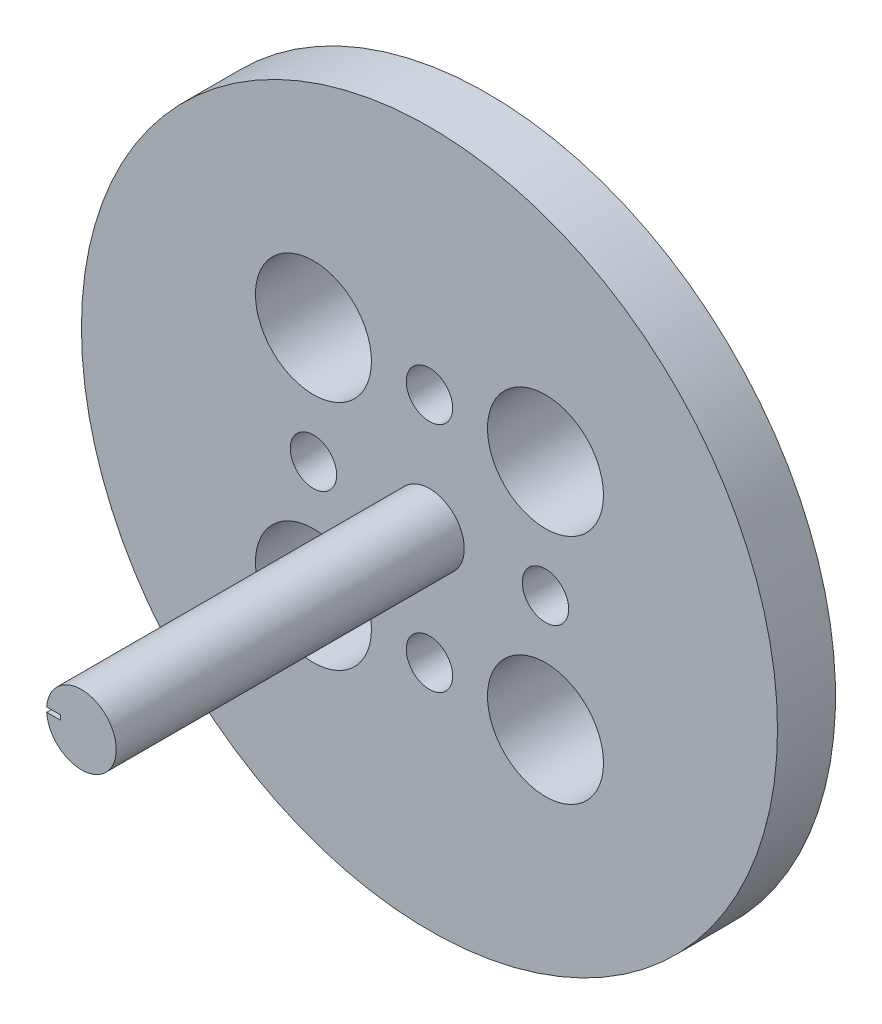
ISO-10303-21;
HEADER;
FILE_DESCRIPTION(('STEP AP214'),'2;1');
FILE_NAME('part.step','',(''),(''),'','','');
FILE_SCHEMA(('AUTOMOTIVE_DESIGN { 1 0 10303 214 1 1 1 1 }'));
ENDSEC;
DATA;
#1=APPLICATION_CONTEXT('core data for automotive mechanical design processes');
#2=APPLICATION_PROTOCOL_DEFINITION('international standard','automotive_design',2000,#1);
#3=PRODUCT_CONTEXT('',#1,'mechanical');
#4=PRODUCT('Part','Part','',(#3));
#5=PRODUCT_RELATED_PRODUCT_CATEGORY('part','',(#4));
#6=PRODUCT_DEFINITION_FORMATION('','',#4);
#7=PRODUCT_DEFINITION_CONTEXT('part definition',#1,'design');
#8=PRODUCT_DEFINITION('design','',#6,#7);
#9=PRODUCT_DEFINITION_SHAPE('','',#8);
#10=(LENGTH_UNIT() NAMED_UNIT(*) SI_UNIT(.MILLI.,.METRE.));
#11=(NAMED_UNIT(*) PLANE_ANGLE_UNIT() SI_UNIT($,.RADIAN.));
#12=(NAMED_UNIT(*) SI_UNIT($,.STERADIAN.) SOLID_ANGLE_UNIT());
#13=UNCERTAINTY_MEASURE_WITH_UNIT(LENGTH_MEASURE(1.E-05),#10,'distance_accuracy_value','');
#14=(GEOMETRIC_REPRESENTATION_CONTEXT(3) GLOBAL_UNCERTAINTY_ASSIGNED_CONTEXT((#13)) GLOBAL_UNIT_ASSIGNED_CONTEXT((#10,
#11,#12)) REPRESENTATION_CONTEXT('',''));
#15=CARTESIAN_POINT('',(0.,0.,0.));
#16=DIRECTION('',(0.,0.,1.));
#17=DIRECTION('',(1.,0.,0.));
#18=AXIS2_PLACEMENT_3D('',#15,#16,#17);
#19=CARTESIAN_POINT('',(0.,0.,5.));
#20=DIRECTION('',(0.,0.,1.));
#21=DIRECTION('',(1.,0.,0.));
#22=AXIS2_PLACEMENT_3D('',#19,#20,#21);
#23=PLANE('',#22);
#24=CARTESIAN_POINT('',(0.,5.,5.));
#25=DIRECTION('',(0.,0.,1.));
#26=DIRECTION('',(1.,0.,0.));
#27=AXIS2_PLACEMENT_3D('',#24,#25,#26);
#28=CIRCLE('',#27,1.);
#29=CARTESIAN_POINT('',(1.,5.,5.));
#30=VERTEX_POINT('',#29);
#31=EDGE_CURVE('E99',#30,#30,#28,.T.);
#32=ORIENTED_EDGE('',*,*,#31,.F.);
#33=EDGE_LOOP('',(#32));
#34=FACE_BOUND('',#33,.T.);
#35=CARTESIAN_POINT('',(-5.,0.,5.));
#36=DIRECTION('',(0.,0.,1.));
#37=DIRECTION('',(1.,0.,0.));
#38=AXIS2_PLACEMENT_3D('',#35,#36,#37);
#39=CIRCLE('',#38,1.00000000000002);
#40=CARTESIAN_POINT('',(-3.99999999999998,0.,5.));
#41=VERTEX_POINT('',#40);
#42=EDGE_CURVE('E307',#41,#41,#39,.T.);
#43=ORIENTED_EDGE('',*,*,#42,.F.);
#44=EDGE_LOOP('',(#43));
#45=FACE_BOUND('',#44,.T.);
#46=CARTESIAN_POINT('',(0.,-5.,5.));
#47=DIRECTION('',(0.,0.,1.));
#48=DIRECTION('',(1.,0.,0.));
#49=AXIS2_PLACEMENT_3D('',#46,#47,#48);
#50=CIRCLE('',#49,1.00000000000003);
#51=CARTESIAN_POINT('',(1.00000000000003,-5.,5.));
#52=VERTEX_POINT('',#51);
#53=EDGE_CURVE('E296',#52,#52,#50,.T.);
#54=ORIENTED_EDGE('',*,*,#53,.F.);
#55=EDGE_LOOP('',(#54));
#56=FACE_BOUND('',#55,.T.);
#57=CARTESIAN_POINT('',(5.,0.,5.));
#58=DIRECTION('',(0.,0.,1.));
#59=DIRECTION('',(1.,0.,0.));
#60=AXIS2_PLACEMENT_3D('',#57,#58,#59);
#61=CIRCLE('',#60,1.00000000000005);
#62=CARTESIAN_POINT('',(6.00000000000005,0.,5.));
#63=VERTEX_POINT('',#62);
#64=EDGE_CURVE('E291',#63,#63,#61,.T.);
#65=ORIENTED_EDGE('',*,*,#64,.F.);
#66=EDGE_LOOP('',(#65));
#67=FACE_BOUND('',#66,.T.);
#68=CARTESIAN_POINT('',(-5.,-4.99999999999995,5.));
#69=DIRECTION('',(0.,0.,1.));
#70=DIRECTION('',(1.,0.,0.));
#71=AXIS2_PLACEMENT_3D('',#68,#69,#70);
#72=CIRCLE('',#71,2.5);
#73=CARTESIAN_POINT('',(-2.5,-4.99999999999995,5.));
#74=VERTEX_POINT('',#73);
#75=EDGE_CURVE('E130',#74,#74,#72,.T.);
#76=ORIENTED_EDGE('',*,*,#75,.F.);
#77=EDGE_LOOP('',(#76));
#78=FACE_BOUND('',#77,.T.);
#79=CARTESIAN_POINT('',(4.99999999999998,-4.99999999999996,5.));
#80=DIRECTION('',(0.,0.,1.));
#81=DIRECTION('',(1.,0.,0.));
#82=AXIS2_PLACEMENT_3D('',#79,#80,#81);
#83=CIRCLE('',#82,2.5);
#84=CARTESIAN_POINT('',(7.49999999999998,-4.99999999999996,5.));
#85=VERTEX_POINT('',#84);
#86=EDGE_CURVE('E144',#85,#85,#83,.T.);
#87=ORIENTED_EDGE('',*,*,#86,.F.);
#88=EDGE_LOOP('',(#87));
#89=FACE_BOUND('',#88,.T.);
#90=CARTESIAN_POINT('',(5.,4.99999999999999,5.));
#91=DIRECTION('',(0.,0.,1.));
#92=DIRECTION('',(1.,0.,0.));
#93=AXIS2_PLACEMENT_3D('',#90,#91,#92);
#94=CIRCLE('',#93,2.5);
#95=CARTESIAN_POINT('',(7.5,4.99999999999999,5.));
#96=VERTEX_POINT('',#95);
#97=EDGE_CURVE('E136',#96,#96,#94,.T.);
#98=ORIENTED_EDGE('',*,*,#97,.F.);
#99=EDGE_LOOP('',(#98));
#100=FACE_BOUND('',#99,.T.);
#101=CARTESIAN_POINT('',(-5.,5.,5.));
#102=DIRECTION('',(0.,0.,1.));
#103=DIRECTION('',(1.,0.,0.));
#104=AXIS2_PLACEMENT_3D('',#101,#102,#103);
#105=CIRCLE('',#104,2.5);
#106=CARTESIAN_POINT('',(-2.5,5.,5.));
#107=VERTEX_POINT('',#106);
#108=EDGE_CURVE('E135',#107,#107,#105,.T.);
#109=ORIENTED_EDGE('',*,*,#108,.F.);
#110=EDGE_LOOP('',(#109));
#111=FACE_BOUND('',#110,.T.);
#112=CARTESIAN_POINT('',(0.,0.,5.));
#113=DIRECTION('',(0.,0.,1.));
#114=DIRECTION('',(1.,0.,0.));
#115=AXIS2_PLACEMENT_3D('',#112,#113,#114);
#116=CIRCLE('',#115,15.);
#117=CARTESIAN_POINT('',(15.,0.,5.));
#118=VERTEX_POINT('',#117);
#119=EDGE_CURVE('E11',#118,#118,#116,.T.);
#120=ORIENTED_EDGE('',*,*,#119,.T.);
#121=EDGE_LOOP('',(#120));
#122=FACE_BOUND('',#121,.T.);
#123=DIRECTION('',(0.,1.,0.));
#124=VECTOR('',#123,1.);
#125=CARTESIAN_POINT('',(-0.901034129813294,0.,5.));
#126=LINE('',#125,#124);
#127=CARTESIAN_POINT('',(-0.901034129813294,-0.1,5.));
#128=VERTEX_POINT('',#127);
#129=CARTESIAN_POINT('',(-0.901034129813294,0.1,5.));
#130=VERTEX_POINT('',#129);
#131=EDGE_CURVE('E54',#128,#130,#126,.T.);
#132=ORIENTED_EDGE('',*,*,#131,.T.);
#133=DIRECTION('',(-1.,0.,0.));
#134=VECTOR('',#133,1.);
#135=CARTESIAN_POINT('',(0.,0.100000000000001,5.));
#136=LINE('',#135,#134);
#137=CARTESIAN_POINT('',(-1.49666295470958,0.1,5.));
#138=VERTEX_POINT('',#137);
#139=EDGE_CURVE('E127',#130,#138,#136,.T.);
#140=ORIENTED_EDGE('',*,*,#139,.T.);
#141=CARTESIAN_POINT('',(0.,0.,5.));
#142=DIRECTION('',(0.,0.,1.));
#143=DIRECTION('',(1.,0.,0.));
#144=AXIS2_PLACEMENT_3D('',#141,#142,#143);
#145=CIRCLE('',#144,1.5);
#146=CARTESIAN_POINT('',(-1.49666295470958,-0.1,5.));
#147=VERTEX_POINT('',#146);
#148=EDGE_CURVE('E85',#147,#138,#145,.T.);
#149=ORIENTED_EDGE('',*,*,#148,.F.);
#150=DIRECTION('',(-1.,0.,0.));
#151=VECTOR('',#150,1.);
#152=CARTESIAN_POINT('',(0.,-0.100000000000001,5.));
#153=LINE('',#152,#151);
#154=EDGE_CURVE('E59',#128,#147,#153,.T.);
#155=ORIENTED_EDGE('',*,*,#154,.F.);
#156=EDGE_LOOP('',(#132,#140,#149,#155));
#157=FACE_BOUND('',#156,.T.);
#158=ADVANCED_FACE('F38',(#34,#45,#56,#67,#78,#89,#100,#111,#122,#157),#23,.T.);
#159=CARTESIAN_POINT('',(0.,0.,5.));
#160=DIRECTION('',(0.,0.,-1.));
#161=DIRECTION('',(-1.,0.,0.));
#162=AXIS2_PLACEMENT_3D('',#159,#160,#161);
#163=CYLINDRICAL_SURFACE('',#162,15.);
#164=ORIENTED_EDGE('',*,*,#119,.F.);
#165=EDGE_LOOP('',(#164));
#166=FACE_BOUND('',#165,.T.);
#167=CARTESIAN_POINT('',(0.,0.,2.5));
#168=DIRECTION('',(0.,0.,-1.));
#169=DIRECTION('',(-1.,0.,0.));
#170=AXIS2_PLACEMENT_3D('',#167,#168,#169);
#171=CIRCLE('',#170,15.);
#172=CARTESIAN_POINT('',(-15.,0.,2.5));
#173=VERTEX_POINT('',#172);
#174=EDGE_CURVE('E47',#173,#173,#171,.T.);
#175=ORIENTED_EDGE('',*,*,#174,.F.);
#176=EDGE_LOOP('',(#175));
#177=FACE_BOUND('',#176,.T.);
#178=ADVANCED_FACE('F40',(#166,#177),#163,.T.);
#179=CARTESIAN_POINT('',(0.,0.,2.5));
#180=DIRECTION('',(0.,0.,-1.));
#181=DIRECTION('',(-1.,0.,0.));
#182=AXIS2_PLACEMENT_3D('',#179,#180,#181);
#183=PLANE('',#182);
#184=CARTESIAN_POINT('',(0.,0.,2.5));
#185=DIRECTION('',(0.,0.,-1.));
#186=DIRECTION('',(-1.,0.,0.));
#187=AXIS2_PLACEMENT_3D('',#184,#185,#186);
#188=CIRCLE('',#187,10.);
#189=CARTESIAN_POINT('',(-10.,0.,2.5));
#190=VERTEX_POINT('',#189);
#191=EDGE_CURVE('E163',#190,#190,#188,.T.);
#192=ORIENTED_EDGE('',*,*,#191,.F.);
#193=EDGE_LOOP('',(#192));
#194=FACE_BOUND('',#193,.T.);
#195=ORIENTED_EDGE('',*,*,#174,.T.);
#196=EDGE_LOOP('',(#195));
#197=FACE_BOUND('',#196,.T.);
#198=ADVANCED_FACE('F173',(#194,#197),#183,.T.);
#199=CARTESIAN_POINT('',(0.,0.,2.5));
#200=DIRECTION('',(0.,0.,-1.));
#201=DIRECTION('',(-1.,0.,0.));
#202=AXIS2_PLACEMENT_3D('',#199,#200,#201);
#203=CYLINDRICAL_SURFACE('',#202,10.);
#204=ORIENTED_EDGE('',*,*,#191,.T.);
#205=EDGE_LOOP('',(#204));
#206=FACE_BOUND('',#205,.T.);
#207=CARTESIAN_POINT('',(0.,0.,0.));
#208=DIRECTION('',(0.,0.,-1.));
#209=DIRECTION('',(-1.,0.,0.));
#210=AXIS2_PLACEMENT_3D('',#207,#208,#209);
#211=CIRCLE('',#210,10.);
#212=CARTESIAN_POINT('',(-10.,0.,0.));
#213=VERTEX_POINT('',#212);
#214=EDGE_CURVE('E159',#213,#213,#211,.T.);
#215=ORIENTED_EDGE('',*,*,#214,.F.);
#216=EDGE_LOOP('',(#215));
#217=FACE_BOUND('',#216,.T.);
#218=ADVANCED_FACE('F180',(#206,#217),#203,.T.);
#219=CARTESIAN_POINT('',(0.,0.,0.));
#220=DIRECTION('',(0.,0.,1.));
#221=DIRECTION('',(1.,0.,0.));
#222=AXIS2_PLACEMENT_3D('',#219,#220,#221);
#223=PLANE('',#222);
#224=CARTESIAN_POINT('',(0.,5.,0.));
#225=DIRECTION('',(0.,0.,-1.));
#226=DIRECTION('',(-1.,0.,0.));
#227=AXIS2_PLACEMENT_3D('',#224,#225,#226);
#228=CIRCLE('',#227,1.);
#229=CARTESIAN_POINT('',(-1.,5.,0.));
#230=VERTEX_POINT('',#229);
#231=EDGE_CURVE('E210',#230,#230,#228,.T.);
#232=ORIENTED_EDGE('',*,*,#231,.F.);
#233=EDGE_LOOP('',(#232));
#234=FACE_BOUND('',#233,.T.);
#235=CARTESIAN_POINT('',(-5.,0.,0.));
#236=DIRECTION('',(0.,0.,-1.));
#237=DIRECTION('',(-1.,0.,0.));
#238=AXIS2_PLACEMENT_3D('',#235,#236,#237);
#239=CIRCLE('',#238,1.00000000000002);
#240=CARTESIAN_POINT('',(-6.00000000000002,0.,0.));
#241=VERTEX_POINT('',#240);
#242=EDGE_CURVE('E214',#241,#241,#239,.T.);
#243=ORIENTED_EDGE('',*,*,#242,.F.);
#244=EDGE_LOOP('',(#243));
#245=FACE_BOUND('',#244,.T.);
#246=CARTESIAN_POINT('',(0.,-5.,0.));
#247=DIRECTION('',(0.,0.,-1.));
#248=DIRECTION('',(-1.,0.,0.));
#249=AXIS2_PLACEMENT_3D('',#246,#247,#248);
#250=CIRCLE('',#249,1.00000000000003);
#251=CARTESIAN_POINT('',(-1.00000000000003,-5.,0.));
#252=VERTEX_POINT('',#251);
#253=EDGE_CURVE('E218',#252,#252,#250,.T.);
#254=ORIENTED_EDGE('',*,*,#253,.F.);
#255=EDGE_LOOP('',(#254));
#256=FACE_BOUND('',#255,.T.);
#257=CARTESIAN_POINT('',(5.,0.,0.));
#258=DIRECTION('',(0.,0.,-1.));
#259=DIRECTION('',(-1.,0.,0.));
#260=AXIS2_PLACEMENT_3D('',#257,#258,#259);
#261=CIRCLE('',#260,1.00000000000005);
#262=CARTESIAN_POINT('',(3.99999999999995,0.,0.));
#263=VERTEX_POINT('',#262);
#264=EDGE_CURVE('E222',#263,#263,#261,.T.);
#265=ORIENTED_EDGE('',*,*,#264,.F.);
#266=EDGE_LOOP('',(#265));
#267=FACE_BOUND('',#266,.T.);
#268=ORIENTED_EDGE('',*,*,#214,.T.);
#269=EDGE_LOOP('',(#268));
#270=FACE_BOUND('',#269,.T.);
#271=CARTESIAN_POINT('',(-5.,5.,0.));
#272=DIRECTION('',(0.,0.,1.));
#273=DIRECTION('',(1.,0.,0.));
#274=AXIS2_PLACEMENT_3D('',#271,#272,#273);
#275=CIRCLE('',#274,2.5);
#276=CARTESIAN_POINT('',(-2.5,5.,0.));
#277=VERTEX_POINT('',#276);
#278=EDGE_CURVE('E155',#277,#277,#275,.T.);
#279=ORIENTED_EDGE('',*,*,#278,.T.);
#280=EDGE_LOOP('',(#279));
#281=FACE_BOUND('',#280,.T.);
#282=CARTESIAN_POINT('',(5.,4.99999999999999,0.));
#283=DIRECTION('',(0.,0.,1.));
#284=DIRECTION('',(1.,0.,0.));
#285=AXIS2_PLACEMENT_3D('',#282,#283,#284);
#286=CIRCLE('',#285,2.5);
#287=CARTESIAN_POINT('',(7.5,4.99999999999999,0.));
#288=VERTEX_POINT('',#287);
#289=EDGE_CURVE('E131',#288,#288,#286,.T.);
#290=ORIENTED_EDGE('',*,*,#289,.T.);
#291=EDGE_LOOP('',(#290));
#292=FACE_BOUND('',#291,.T.);
#293=CARTESIAN_POINT('',(4.99999999999998,-4.99999999999996,0.));
#294=DIRECTION('',(0.,0.,1.));
#295=DIRECTION('',(1.,0.,0.));
#296=AXIS2_PLACEMENT_3D('',#293,#294,#295);
#297=CIRCLE('',#296,2.5);
#298=CARTESIAN_POINT('',(7.49999999999998,-4.99999999999996,0.));
#299=VERTEX_POINT('',#298);
#300=EDGE_CURVE('E140',#299,#299,#297,.T.);
#301=ORIENTED_EDGE('',*,*,#300,.T.);
#302=EDGE_LOOP('',(#301));
#303=FACE_BOUND('',#302,.T.);
#304=CARTESIAN_POINT('',(-5.,-4.99999999999995,0.));
#305=DIRECTION('',(0.,0.,1.));
#306=DIRECTION('',(1.,0.,0.));
#307=AXIS2_PLACEMENT_3D('',#304,#305,#306);
#308=CIRCLE('',#307,2.5);
#309=CARTESIAN_POINT('',(-2.5,-4.99999999999995,0.));
#310=VERTEX_POINT('',#309);
#311=EDGE_CURVE('E148',#310,#310,#308,.T.);
#312=ORIENTED_EDGE('',*,*,#311,.T.);
#313=EDGE_LOOP('',(#312));
#314=FACE_BOUND('',#313,.T.);
#315=ADVANCED_FACE('F195',(#234,#245,#256,#267,#270,#281,#292,#303,#314),#223,.F.);
#316=CARTESIAN_POINT('',(-5.,5.,0.));
#317=DIRECTION('',(0.,0.,1.));
#318=DIRECTION('',(1.,0.,0.));
#319=AXIS2_PLACEMENT_3D('',#316,#317,#318);
#320=CYLINDRICAL_SURFACE('',#319,2.5);
#321=ORIENTED_EDGE('',*,*,#278,.F.);
#322=EDGE_LOOP('',(#321));
#323=FACE_BOUND('',#322,.T.);
#324=ORIENTED_EDGE('',*,*,#108,.T.);
#325=EDGE_LOOP('',(#324));
#326=FACE_BOUND('',#325,.T.);
#327=ADVANCED_FACE('F196',(#323,#326),#320,.F.);
#328=CARTESIAN_POINT('',(5.,4.99999999999999,0.));
#329=DIRECTION('',(0.,0.,1.));
#330=DIRECTION('',(1.,0.,0.));
#331=AXIS2_PLACEMENT_3D('',#328,#329,#330);
#332=CYLINDRICAL_SURFACE('',#331,2.5);
#333=ORIENTED_EDGE('',*,*,#289,.F.);
#334=EDGE_LOOP('',(#333));
#335=FACE_BOUND('',#334,.T.);
#336=ORIENTED_EDGE('',*,*,#97,.T.);
#337=EDGE_LOOP('',(#336));
#338=FACE_BOUND('',#337,.T.);
#339=ADVANCED_FACE('F202',(#335,#338),#332,.F.);
#340=CARTESIAN_POINT('',(4.99999999999998,-4.99999999999996,0.));
#341=DIRECTION('',(0.,0.,1.));
#342=DIRECTION('',(1.,0.,0.));
#343=AXIS2_PLACEMENT_3D('',#340,#341,#342);
#344=CYLINDRICAL_SURFACE('',#343,2.5);
#345=ORIENTED_EDGE('',*,*,#300,.F.);
#346=EDGE_LOOP('',(#345));
#347=FACE_BOUND('',#346,.T.);
#348=ORIENTED_EDGE('',*,*,#86,.T.);
#349=EDGE_LOOP('',(#348));
#350=FACE_BOUND('',#349,.T.);
#351=ADVANCED_FACE('F236',(#347,#350),#344,.F.);
#352=CARTESIAN_POINT('',(-5.,-4.99999999999995,0.));
#353=DIRECTION('',(0.,0.,1.));
#354=DIRECTION('',(1.,0.,0.));
#355=AXIS2_PLACEMENT_3D('',#352,#353,#354);
#356=CYLINDRICAL_SURFACE('',#355,2.5);
#357=ORIENTED_EDGE('',*,*,#311,.F.);
#358=EDGE_LOOP('',(#357));
#359=FACE_BOUND('',#358,.T.);
#360=ORIENTED_EDGE('',*,*,#75,.T.);
#361=EDGE_LOOP('',(#360));
#362=FACE_BOUND('',#361,.T.);
#363=ADVANCED_FACE('F233',(#359,#362),#356,.F.);
#364=CARTESIAN_POINT('',(0.,0.100000000000001,20.));
#365=DIRECTION('',(0.,1.,0.));
#366=DIRECTION('',(-1.,0.,0.));
#367=AXIS2_PLACEMENT_3D('',#364,#365,#366);
#368=PLANE('',#367);
#369=ORIENTED_EDGE('',*,*,#139,.F.);
#370=DIRECTION('',(0.,0.,-1.));
#371=VECTOR('',#370,1.);
#372=CARTESIAN_POINT('',(-0.901034129813294,0.1,20.));
#373=LINE('',#372,#371);
#374=CARTESIAN_POINT('',(-0.901034129813294,0.1,20.));
#375=VERTEX_POINT('',#374);
#376=EDGE_CURVE('E96',#375,#130,#373,.T.);
#377=ORIENTED_EDGE('',*,*,#376,.F.);
#378=DIRECTION('',(1.,0.,0.));
#379=VECTOR('',#378,1.);
#380=CARTESIAN_POINT('',(0.,0.100000000000001,20.));
#381=LINE('',#380,#379);
#382=CARTESIAN_POINT('',(-1.49666295470958,0.1,20.));
#383=VERTEX_POINT('',#382);
#384=EDGE_CURVE('E93',#383,#375,#381,.T.);
#385=ORIENTED_EDGE('',*,*,#384,.F.);
#386=DIRECTION('',(0.,0.,-1.));
#387=VECTOR('',#386,1.);
#388=CARTESIAN_POINT('',(-1.49666295470958,0.1,20.));
#389=LINE('',#388,#387);
#390=EDGE_CURVE('E79',#383,#138,#389,.T.);
#391=ORIENTED_EDGE('',*,*,#390,.T.);
#392=EDGE_LOOP('',(#369,#377,#385,#391));
#393=FACE_BOUND('',#392,.T.);
#394=ADVANCED_FACE('F94',(#393),#368,.F.);
#395=CARTESIAN_POINT('',(-0.901034129813294,0.,20.));
#396=DIRECTION('',(1.,0.,0.));
#397=DIRECTION('',(0.,0.,-1.));
#398=AXIS2_PLACEMENT_3D('',#395,#396,#397);
#399=PLANE('',#398);
#400=ORIENTED_EDGE('',*,*,#131,.F.);
#401=DIRECTION('',(0.,0.,-1.));
#402=VECTOR('',#401,1.);
#403=CARTESIAN_POINT('',(-0.901034129813294,-0.1,20.));
#404=LINE('',#403,#402);
#405=CARTESIAN_POINT('',(-0.901034129813294,-0.1,20.));
#406=VERTEX_POINT('',#405);
#407=EDGE_CURVE('E115',#406,#128,#404,.T.);
#408=ORIENTED_EDGE('',*,*,#407,.F.);
#409=DIRECTION('',(0.,-1.,0.));
#410=VECTOR('',#409,1.);
#411=CARTESIAN_POINT('',(-0.901034129813294,0.,20.));
#412=LINE('',#411,#410);
#413=EDGE_CURVE('E89',#375,#406,#412,.T.);
#414=ORIENTED_EDGE('',*,*,#413,.F.);
#415=ORIENTED_EDGE('',*,*,#376,.T.);
#416=EDGE_LOOP('',(#400,#408,#414,#415));
#417=FACE_BOUND('',#416,.T.);
#418=ADVANCED_FACE('F259',(#417),#399,.F.);
#419=CARTESIAN_POINT('',(0.,-0.100000000000001,20.));
#420=DIRECTION('',(0.,1.,0.));
#421=DIRECTION('',(-1.,0.,0.));
#422=AXIS2_PLACEMENT_3D('',#419,#420,#421);
#423=PLANE('',#422);
#424=ORIENTED_EDGE('',*,*,#407,.T.);
#425=ORIENTED_EDGE('',*,*,#154,.T.);
#426=DIRECTION('',(0.,0.,-1.));
#427=VECTOR('',#426,1.);
#428=CARTESIAN_POINT('',(-1.49666295470958,-0.1,20.));
#429=LINE('',#428,#427);
#430=CARTESIAN_POINT('',(-1.49666295470958,-0.1,20.));
#431=VERTEX_POINT('',#430);
#432=EDGE_CURVE('E88',#431,#147,#429,.T.);
#433=ORIENTED_EDGE('',*,*,#432,.F.);
#434=DIRECTION('',(1.,0.,0.));
#435=VECTOR('',#434,1.);
#436=CARTESIAN_POINT('',(0.,-0.100000000000001,20.));
#437=LINE('',#436,#435);
#438=EDGE_CURVE('E104',#431,#406,#437,.T.);
#439=ORIENTED_EDGE('',*,*,#438,.T.);
#440=EDGE_LOOP('',(#424,#425,#433,#439));
#441=FACE_BOUND('',#440,.T.);
#442=ADVANCED_FACE('F262',(#441),#423,.T.);
#443=CARTESIAN_POINT('',(0.,0.,20.));
#444=DIRECTION('',(0.,0.,-1.));
#445=DIRECTION('',(-1.,0.,0.));
#446=AXIS2_PLACEMENT_3D('',#443,#444,#445);
#447=CYLINDRICAL_SURFACE('',#446,1.5);
#448=ORIENTED_EDGE('',*,*,#432,.T.);
#449=ORIENTED_EDGE('',*,*,#148,.T.);
#450=ORIENTED_EDGE('',*,*,#390,.F.);
#451=CARTESIAN_POINT('',(0.,0.,20.));
#452=DIRECTION('',(0.,0.,-1.));
#453=DIRECTION('',(-1.,0.,0.));
#454=AXIS2_PLACEMENT_3D('',#451,#452,#453);
#455=CIRCLE('',#454,1.5);
#456=EDGE_CURVE('E84',#383,#431,#455,.T.);
#457=ORIENTED_EDGE('',*,*,#456,.T.);
#458=EDGE_LOOP('',(#448,#449,#450,#457));
#459=FACE_BOUND('',#458,.T.);
#460=ADVANCED_FACE('F82',(#459),#447,.T.);
#461=CARTESIAN_POINT('',(0.,0.,20.));
#462=DIRECTION('',(0.,0.,-1.));
#463=DIRECTION('',(-1.,0.,0.));
#464=AXIS2_PLACEMENT_3D('',#461,#462,#463);
#465=PLANE('',#464);
#466=ORIENTED_EDGE('',*,*,#384,.T.);
#467=ORIENTED_EDGE('',*,*,#413,.T.);
#468=ORIENTED_EDGE('',*,*,#438,.F.);
#469=ORIENTED_EDGE('',*,*,#456,.F.);
#470=EDGE_LOOP('',(#466,#467,#468,#469));
#471=FACE_BOUND('',#470,.T.);
#472=ADVANCED_FACE('F102',(#471),#465,.F.);
#473=CARTESIAN_POINT('',(5.,0.,20.));
#474=DIRECTION('',(0.,0.,-1.));
#475=DIRECTION('',(-1.,0.,0.));
#476=AXIS2_PLACEMENT_3D('',#473,#474,#475);
#477=CYLINDRICAL_SURFACE('',#476,1.00000000000005);
#478=ORIENTED_EDGE('',*,*,#64,.T.);
#479=EDGE_LOOP('',(#478));
#480=FACE_BOUND('',#479,.T.);
#481=ORIENTED_EDGE('',*,*,#264,.T.);
#482=EDGE_LOOP('',(#481));
#483=FACE_BOUND('',#482,.T.);
#484=ADVANCED_FACE('F271',(#480,#483),#477,.F.);
#485=CARTESIAN_POINT('',(0.,-5.,20.));
#486=DIRECTION('',(0.,0.,-1.));
#487=DIRECTION('',(-1.,0.,0.));
#488=AXIS2_PLACEMENT_3D('',#485,#486,#487);
#489=CYLINDRICAL_SURFACE('',#488,1.00000000000003);
#490=ORIENTED_EDGE('',*,*,#53,.T.);
#491=EDGE_LOOP('',(#490));
#492=FACE_BOUND('',#491,.T.);
#493=ORIENTED_EDGE('',*,*,#253,.T.);
#494=EDGE_LOOP('',(#493));
#495=FACE_BOUND('',#494,.T.);
#496=ADVANCED_FACE('F274',(#492,#495),#489,.F.);
#497=CARTESIAN_POINT('',(-5.,0.,20.));
#498=DIRECTION('',(0.,0.,-1.));
#499=DIRECTION('',(-1.,0.,0.));
#500=AXIS2_PLACEMENT_3D('',#497,#498,#499);
#501=CYLINDRICAL_SURFACE('',#500,1.00000000000002);
#502=ORIENTED_EDGE('',*,*,#42,.T.);
#503=EDGE_LOOP('',(#502));
#504=FACE_BOUND('',#503,.T.);
#505=ORIENTED_EDGE('',*,*,#242,.T.);
#506=EDGE_LOOP('',(#505));
#507=FACE_BOUND('',#506,.T.);
#508=ADVANCED_FACE('F278',(#504,#507),#501,.F.);
#509=CARTESIAN_POINT('',(0.,5.,20.));
#510=DIRECTION('',(0.,0.,-1.));
#511=DIRECTION('',(-1.,0.,0.));
#512=AXIS2_PLACEMENT_3D('',#509,#510,#511);
#513=CYLINDRICAL_SURFACE('',#512,1.);
#514=ORIENTED_EDGE('',*,*,#31,.T.);
#515=EDGE_LOOP('',(#514));
#516=FACE_BOUND('',#515,.T.);
#517=ORIENTED_EDGE('',*,*,#231,.T.);
#518=EDGE_LOOP('',(#517));
#519=FACE_BOUND('',#518,.T.);
#520=ADVANCED_FACE('F282',(#516,#519),#513,.F.);
#521=CLOSED_SHELL('',(#158,#178,#198,#218,#315,#327,#339,#351,#363,#394,#418,#442,#460,#472,
#484,#496,#508,#520));
#522=MANIFOLD_SOLID_BREP('B2',#521);
#523=ADVANCED_BREP_SHAPE_REPRESENTATION('',(#18,#522),#14);
#524=SHAPE_DEFINITION_REPRESENTATION(#9,#523);
ENDSEC;
END-ISO-10303-21;
